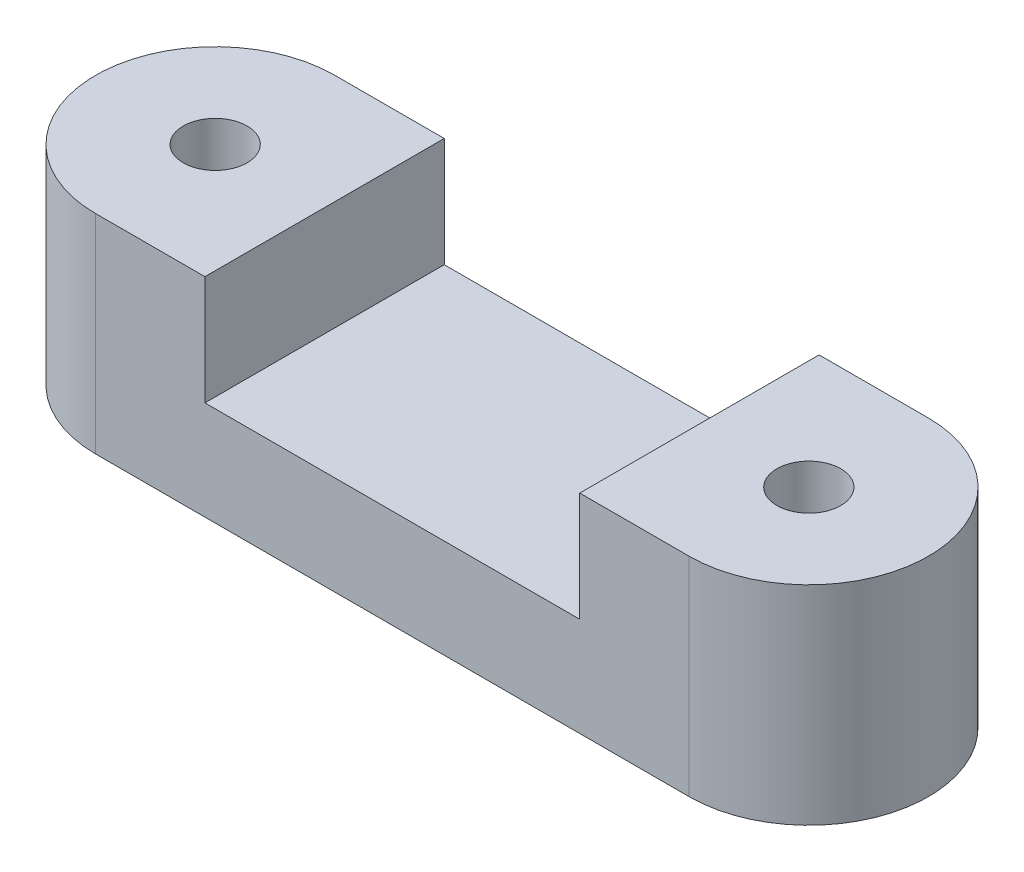
ISO-10303-21;
HEADER;
FILE_DESCRIPTION(('STEP AP214'),'2;1');
FILE_NAME('part.step','',(''),(''),'','','');
FILE_SCHEMA(('AUTOMOTIVE_DESIGN { 1 0 10303 214 1 1 1 1 }'));
ENDSEC;
DATA;
#1=APPLICATION_CONTEXT('core data for automotive mechanical design processes');
#2=APPLICATION_PROTOCOL_DEFINITION('international standard','automotive_design',2000,#1);
#3=PRODUCT_CONTEXT('',#1,'mechanical');
#4=PRODUCT('Part','Part','',(#3));
#5=PRODUCT_RELATED_PRODUCT_CATEGORY('part','',(#4));
#6=PRODUCT_DEFINITION_FORMATION('','',#4);
#7=PRODUCT_DEFINITION_CONTEXT('part definition',#1,'design');
#8=PRODUCT_DEFINITION('design','',#6,#7);
#9=PRODUCT_DEFINITION_SHAPE('','',#8);
#10=(LENGTH_UNIT() NAMED_UNIT(*) SI_UNIT(.MILLI.,.METRE.));
#11=(NAMED_UNIT(*) PLANE_ANGLE_UNIT() SI_UNIT($,.RADIAN.));
#12=(NAMED_UNIT(*) SI_UNIT($,.STERADIAN.) SOLID_ANGLE_UNIT());
#13=UNCERTAINTY_MEASURE_WITH_UNIT(LENGTH_MEASURE(1.E-05),#10,'distance_accuracy_value','');
#14=(GEOMETRIC_REPRESENTATION_CONTEXT(3) GLOBAL_UNCERTAINTY_ASSIGNED_CONTEXT((#13)) GLOBAL_UNIT_ASSIGNED_CONTEXT((#10,
#11,#12)) REPRESENTATION_CONTEXT('',''));
#15=CARTESIAN_POINT('',(0.,0.,0.));
#16=DIRECTION('',(0.,0.,1.));
#17=DIRECTION('',(1.,0.,0.));
#18=AXIS2_PLACEMENT_3D('',#15,#16,#17);
#19=CARTESIAN_POINT('',(0.,9.525,0.));
#20=DIRECTION('',(0.,1.,0.));
#21=DIRECTION('',(0.,0.,1.));
#22=AXIS2_PLACEMENT_3D('',#19,#20,#21);
#23=PLANE('',#22);
#24=DIRECTION('',(0.,0.,-1.));
#25=VECTOR('',#24,1.);
#26=CARTESIAN_POINT('',(22.1488,9.525,5.4737));
#27=LINE('',#26,#25);
#28=CARTESIAN_POINT('',(22.1488,9.525,5.4737));
#29=VERTEX_POINT('',#28);
#30=CARTESIAN_POINT('',(22.1488,9.525,-5.4737));
#31=VERTEX_POINT('',#30);
#32=EDGE_CURVE('E179',#29,#31,#27,.T.);
#33=ORIENTED_EDGE('',*,*,#32,.F.);
#34=DIRECTION('',(1.,0.,0.));
#35=VECTOR('',#34,1.);
#36=CARTESIAN_POINT('',(0.,9.525,5.4737));
#37=LINE('',#36,#35);
#38=CARTESIAN_POINT('',(27.1526,9.525,5.4737));
#39=VERTEX_POINT('',#38);
#40=EDGE_CURVE('E144',#29,#39,#37,.T.);
#41=ORIENTED_EDGE('',*,*,#40,.T.);
#42=CARTESIAN_POINT('',(27.1526,9.525,0.));
#43=DIRECTION('',(0.,1.,0.));
#44=DIRECTION('',(0.,0.,1.));
#45=AXIS2_PLACEMENT_3D('',#42,#43,#44);
#46=CIRCLE('',#45,5.4737);
#47=CARTESIAN_POINT('',(27.1526,9.525,-5.4737));
#48=VERTEX_POINT('',#47);
#49=EDGE_CURVE('E146',#39,#48,#46,.T.);
#50=ORIENTED_EDGE('',*,*,#49,.T.);
#51=DIRECTION('',(-1.,0.,0.));
#52=VECTOR('',#51,1.);
#53=CARTESIAN_POINT('',(0.,9.525,-5.4737));
#54=LINE('',#53,#52);
#55=EDGE_CURVE('E148',#48,#31,#54,.T.);
#56=ORIENTED_EDGE('',*,*,#55,.T.);
#57=EDGE_LOOP('',(#33,#41,#50,#56));
#58=FACE_BOUND('',#57,.T.);
#59=CARTESIAN_POINT('',(27.1526,9.525,0.));
#60=DIRECTION('',(0.,1.,0.));
#61=DIRECTION('',(0.,0.,1.));
#62=AXIS2_PLACEMENT_3D('',#59,#60,#61);
#63=CIRCLE('',#62,1.4605);
#64=CARTESIAN_POINT('',(27.1526,9.525,-1.4605));
#65=VERTEX_POINT('',#64);
#66=EDGE_CURVE('E129',#65,#65,#63,.T.);
#67=ORIENTED_EDGE('',*,*,#66,.F.);
#68=EDGE_LOOP('',(#67));
#69=FACE_BOUND('',#68,.T.);
#70=ADVANCED_FACE('F32',(#58,#69),#23,.T.);
#71=DIRECTION('',(0.,0.,1.));
#72=VECTOR('',#71,1.);
#73=CARTESIAN_POINT('',(5.0038,9.525,5.4737));
#74=LINE('',#73,#72);
#75=CARTESIAN_POINT('',(5.0038,9.525,-5.4737));
#76=VERTEX_POINT('',#75);
#77=CARTESIAN_POINT('',(5.0038,9.525,5.4737));
#78=VERTEX_POINT('',#77);
#79=EDGE_CURVE('E178',#76,#78,#74,.T.);
#80=ORIENTED_EDGE('',*,*,#79,.F.);
#81=CARTESIAN_POINT('',(0.,9.525,-5.4737));
#82=VERTEX_POINT('',#81);
#83=EDGE_CURVE('E56',#76,#82,#54,.T.);
#84=ORIENTED_EDGE('',*,*,#83,.T.);
#85=CARTESIAN_POINT('',(0.,9.525,0.));
#86=DIRECTION('',(0.,1.,0.));
#87=DIRECTION('',(0.,0.,1.));
#88=AXIS2_PLACEMENT_3D('',#85,#86,#87);
#89=CIRCLE('',#88,5.4737);
#90=CARTESIAN_POINT('',(0.,9.525,5.4737));
#91=VERTEX_POINT('',#90);
#92=EDGE_CURVE('E142',#82,#91,#89,.T.);
#93=ORIENTED_EDGE('',*,*,#92,.T.);
#94=EDGE_CURVE('E85',#91,#78,#37,.T.);
#95=ORIENTED_EDGE('',*,*,#94,.T.);
#96=EDGE_LOOP('',(#80,#84,#93,#95));
#97=FACE_BOUND('',#96,.T.);
#98=CARTESIAN_POINT('',(0.,9.525,0.));
#99=DIRECTION('',(0.,1.,0.));
#100=DIRECTION('',(0.,0.,1.));
#101=AXIS2_PLACEMENT_3D('',#98,#99,#100);
#102=CIRCLE('',#101,1.4605);
#103=CARTESIAN_POINT('',(0.,9.525,-1.4605));
#104=VERTEX_POINT('',#103);
#105=EDGE_CURVE('E136',#104,#104,#102,.T.);
#106=ORIENTED_EDGE('',*,*,#105,.F.);
#107=EDGE_LOOP('',(#106));
#108=FACE_BOUND('',#107,.T.);
#109=ADVANCED_FACE('F176',(#97,#108),#23,.T.);
#110=CARTESIAN_POINT('',(0.,0.,0.));
#111=DIRECTION('',(0.,1.,0.));
#112=DIRECTION('',(0.,0.,1.));
#113=AXIS2_PLACEMENT_3D('',#110,#111,#112);
#114=PLANE('',#113);
#115=CARTESIAN_POINT('',(0.,0.,0.));
#116=DIRECTION('',(0.,1.,0.));
#117=DIRECTION('',(0.,0.,1.));
#118=AXIS2_PLACEMENT_3D('',#115,#116,#117);
#119=CIRCLE('',#118,5.4737);
#120=CARTESIAN_POINT('',(0.,0.,-5.4737));
#121=VERTEX_POINT('',#120);
#122=CARTESIAN_POINT('',(0.,0.,5.4737));
#123=VERTEX_POINT('',#122);
#124=EDGE_CURVE('E139',#121,#123,#119,.T.);
#125=ORIENTED_EDGE('',*,*,#124,.F.);
#126=DIRECTION('',(-1.,0.,0.));
#127=VECTOR('',#126,1.);
#128=CARTESIAN_POINT('',(0.,0.,-5.4737));
#129=LINE('',#128,#127);
#130=CARTESIAN_POINT('',(27.1526,0.,-5.4737));
#131=VERTEX_POINT('',#130);
#132=EDGE_CURVE('E78',#131,#121,#129,.T.);
#133=ORIENTED_EDGE('',*,*,#132,.F.);
#134=CARTESIAN_POINT('',(27.1526,0.,0.));
#135=DIRECTION('',(0.,1.,0.));
#136=DIRECTION('',(0.,0.,1.));
#137=AXIS2_PLACEMENT_3D('',#134,#135,#136);
#138=CIRCLE('',#137,5.4737);
#139=CARTESIAN_POINT('',(27.1526,0.,5.4737));
#140=VERTEX_POINT('',#139);
#141=EDGE_CURVE('E156',#140,#131,#138,.T.);
#142=ORIENTED_EDGE('',*,*,#141,.F.);
#143=DIRECTION('',(1.,0.,0.));
#144=VECTOR('',#143,1.);
#145=CARTESIAN_POINT('',(0.,0.,5.4737));
#146=LINE('',#145,#144);
#147=EDGE_CURVE('E154',#123,#140,#146,.T.);
#148=ORIENTED_EDGE('',*,*,#147,.F.);
#149=EDGE_LOOP('',(#125,#133,#142,#148));
#150=FACE_BOUND('',#149,.T.);
#151=CARTESIAN_POINT('',(0.,0.,0.));
#152=DIRECTION('',(0.,1.,0.));
#153=DIRECTION('',(0.,0.,1.));
#154=AXIS2_PLACEMENT_3D('',#151,#152,#153);
#155=CIRCLE('',#154,1.4605);
#156=CARTESIAN_POINT('',(0.,0.,-1.4605));
#157=VERTEX_POINT('',#156);
#158=EDGE_CURVE('E132',#157,#157,#155,.T.);
#159=ORIENTED_EDGE('',*,*,#158,.T.);
#160=EDGE_LOOP('',(#159));
#161=FACE_BOUND('',#160,.T.);
#162=CARTESIAN_POINT('',(27.1526,0.,0.));
#163=DIRECTION('',(0.,1.,0.));
#164=DIRECTION('',(0.,0.,1.));
#165=AXIS2_PLACEMENT_3D('',#162,#163,#164);
#166=CIRCLE('',#165,1.4605);
#167=CARTESIAN_POINT('',(27.1526,0.,-1.4605));
#168=VERTEX_POINT('',#167);
#169=EDGE_CURVE('E133',#168,#168,#166,.T.);
#170=ORIENTED_EDGE('',*,*,#169,.T.);
#171=EDGE_LOOP('',(#170));
#172=FACE_BOUND('',#171,.T.);
#173=ADVANCED_FACE('F171',(#150,#161,#172),#114,.F.);
#174=CARTESIAN_POINT('',(0.,9.525,0.));
#175=DIRECTION('',(0.,-1.,0.));
#176=DIRECTION('',(0.,0.,-1.));
#177=AXIS2_PLACEMENT_3D('',#174,#175,#176);
#178=CYLINDRICAL_SURFACE('',#177,5.4737);
#179=ORIENTED_EDGE('',*,*,#124,.T.);
#180=DIRECTION('',(0.,-1.,0.));
#181=VECTOR('',#180,1.);
#182=CARTESIAN_POINT('',(0.,9.525,5.4737));
#183=LINE('',#182,#181);
#184=EDGE_CURVE('E11',#91,#123,#183,.T.);
#185=ORIENTED_EDGE('',*,*,#184,.F.);
#186=ORIENTED_EDGE('',*,*,#92,.F.);
#187=DIRECTION('',(0.,-1.,0.));
#188=VECTOR('',#187,1.);
#189=CARTESIAN_POINT('',(0.,9.525,-5.4737));
#190=LINE('',#189,#188);
#191=EDGE_CURVE('E151',#82,#121,#190,.T.);
#192=ORIENTED_EDGE('',*,*,#191,.T.);
#193=EDGE_LOOP('',(#179,#185,#186,#192));
#194=FACE_BOUND('',#193,.T.);
#195=ADVANCED_FACE('F34',(#194),#178,.T.);
#196=CARTESIAN_POINT('',(0.,9.525,5.4737));
#197=DIRECTION('',(0.,0.,-1.));
#198=DIRECTION('',(-1.,0.,0.));
#199=AXIS2_PLACEMENT_3D('',#196,#197,#198);
#200=PLANE('',#199);
#201=ORIENTED_EDGE('',*,*,#40,.F.);
#202=DIRECTION('',(0.,1.,0.));
#203=VECTOR('',#202,1.);
#204=CARTESIAN_POINT('',(22.1488,4.525,5.4737));
#205=LINE('',#204,#203);
#206=CARTESIAN_POINT('',(22.1488,4.525,5.4737));
#207=VERTEX_POINT('',#206);
#208=EDGE_CURVE('E124',#207,#29,#205,.T.);
#209=ORIENTED_EDGE('',*,*,#208,.F.);
#210=DIRECTION('',(1.,0.,0.));
#211=VECTOR('',#210,1.);
#212=CARTESIAN_POINT('',(5.0038,4.525,5.4737));
#213=LINE('',#212,#211);
#214=CARTESIAN_POINT('',(5.0038,4.525,5.4737));
#215=VERTEX_POINT('',#214);
#216=EDGE_CURVE('E114',#215,#207,#213,.T.);
#217=ORIENTED_EDGE('',*,*,#216,.F.);
#218=DIRECTION('',(0.,1.,0.));
#219=VECTOR('',#218,1.);
#220=CARTESIAN_POINT('',(5.0038,4.525,5.4737));
#221=LINE('',#220,#219);
#222=EDGE_CURVE('E112',#215,#78,#221,.T.);
#223=ORIENTED_EDGE('',*,*,#222,.T.);
#224=ORIENTED_EDGE('',*,*,#94,.F.);
#225=ORIENTED_EDGE('',*,*,#184,.T.);
#226=ORIENTED_EDGE('',*,*,#147,.T.);
#227=DIRECTION('',(0.,-1.,0.));
#228=VECTOR('',#227,1.);
#229=CARTESIAN_POINT('',(27.1526,9.525,5.4737));
#230=LINE('',#229,#228);
#231=EDGE_CURVE('E40',#39,#140,#230,.T.);
#232=ORIENTED_EDGE('',*,*,#231,.F.);
#233=EDGE_LOOP('',(#201,#209,#217,#223,#224,#225,#226,#232));
#234=FACE_BOUND('',#233,.T.);
#235=ADVANCED_FACE('F191',(#234),#200,.F.);
#236=CARTESIAN_POINT('',(27.1526,9.525,0.));
#237=DIRECTION('',(0.,-1.,0.));
#238=DIRECTION('',(0.,0.,-1.));
#239=AXIS2_PLACEMENT_3D('',#236,#237,#238);
#240=CYLINDRICAL_SURFACE('',#239,5.4737);
#241=ORIENTED_EDGE('',*,*,#141,.T.);
#242=DIRECTION('',(0.,-1.,0.));
#243=VECTOR('',#242,1.);
#244=CARTESIAN_POINT('',(27.1526,9.525,-5.4737));
#245=LINE('',#244,#243);
#246=EDGE_CURVE('E160',#48,#131,#245,.T.);
#247=ORIENTED_EDGE('',*,*,#246,.F.);
#248=ORIENTED_EDGE('',*,*,#49,.F.);
#249=ORIENTED_EDGE('',*,*,#231,.T.);
#250=EDGE_LOOP('',(#241,#247,#248,#249));
#251=FACE_BOUND('',#250,.T.);
#252=ADVANCED_FACE('F166',(#251),#240,.T.);
#253=CARTESIAN_POINT('',(0.,9.525,-5.4737));
#254=DIRECTION('',(0.,0.,1.));
#255=DIRECTION('',(1.,0.,0.));
#256=AXIS2_PLACEMENT_3D('',#253,#254,#255);
#257=PLANE('',#256);
#258=DIRECTION('',(-1.,0.,0.));
#259=VECTOR('',#258,1.);
#260=CARTESIAN_POINT('',(5.0038,4.525,-5.4737));
#261=LINE('',#260,#259);
#262=CARTESIAN_POINT('',(22.1488,4.525,-5.4737));
#263=VERTEX_POINT('',#262);
#264=CARTESIAN_POINT('',(5.0038,4.525,-5.4737));
#265=VERTEX_POINT('',#264);
#266=EDGE_CURVE('E115',#263,#265,#261,.T.);
#267=ORIENTED_EDGE('',*,*,#266,.F.);
#268=DIRECTION('',(0.,1.,0.));
#269=VECTOR('',#268,1.);
#270=CARTESIAN_POINT('',(22.1488,4.525,-5.4737));
#271=LINE('',#270,#269);
#272=EDGE_CURVE('E122',#263,#31,#271,.T.);
#273=ORIENTED_EDGE('',*,*,#272,.T.);
#274=ORIENTED_EDGE('',*,*,#55,.F.);
#275=ORIENTED_EDGE('',*,*,#246,.T.);
#276=ORIENTED_EDGE('',*,*,#132,.T.);
#277=ORIENTED_EDGE('',*,*,#191,.F.);
#278=ORIENTED_EDGE('',*,*,#83,.F.);
#279=DIRECTION('',(0.,1.,0.));
#280=VECTOR('',#279,1.);
#281=CARTESIAN_POINT('',(5.0038,4.525,-5.4737));
#282=LINE('',#281,#280);
#283=EDGE_CURVE('E111',#265,#76,#282,.T.);
#284=ORIENTED_EDGE('',*,*,#283,.F.);
#285=EDGE_LOOP('',(#267,#273,#274,#275,#276,#277,#278,#284));
#286=FACE_BOUND('',#285,.T.);
#287=ADVANCED_FACE('F121',(#286),#257,.F.);
#288=CARTESIAN_POINT('',(0.,9.525,0.));
#289=DIRECTION('',(0.,-1.,0.));
#290=DIRECTION('',(0.,0.,-1.));
#291=AXIS2_PLACEMENT_3D('',#288,#289,#290);
#292=CYLINDRICAL_SURFACE('',#291,1.4605);
#293=CARTESIAN_POINT('',(0.,9.525,-1.4605));
#294=CARTESIAN_POINT('',(0.,9.42578125,-1.4605));
#295=CARTESIAN_POINT('',(0.,9.3265625,-1.4605));
#296=CARTESIAN_POINT('',(0.,9.128125,-1.4605));
#297=CARTESIAN_POINT('',(0.,9.02890625,-1.4605));
#298=CARTESIAN_POINT('',(0.,8.83046875,-1.4605));
#299=CARTESIAN_POINT('',(0.,8.73125,-1.4605));
#300=CARTESIAN_POINT('',(0.,8.5328125,-1.4605));
#301=CARTESIAN_POINT('',(0.,8.43359375,-1.4605));
#302=CARTESIAN_POINT('',(0.,8.23515625,-1.4605));
#303=CARTESIAN_POINT('',(0.,8.1359375,-1.4605));
#304=CARTESIAN_POINT('',(0.,7.9375,-1.4605));
#305=CARTESIAN_POINT('',(0.,7.83828125,-1.4605));
#306=CARTESIAN_POINT('',(0.,7.63984375,-1.4605));
#307=CARTESIAN_POINT('',(0.,7.540625,-1.4605));
#308=CARTESIAN_POINT('',(0.,7.3421875,-1.4605));
#309=CARTESIAN_POINT('',(0.,7.24296875,-1.4605));
#310=CARTESIAN_POINT('',(0.,7.04453125,-1.4605));
#311=CARTESIAN_POINT('',(0.,6.9453125,-1.4605));
#312=CARTESIAN_POINT('',(0.,6.746875,-1.4605));
#313=CARTESIAN_POINT('',(0.,6.64765625,-1.4605));
#314=CARTESIAN_POINT('',(0.,6.44921875,-1.4605));
#315=CARTESIAN_POINT('',(0.,6.35,-1.4605));
#316=CARTESIAN_POINT('',(0.,6.1515625,-1.4605));
#317=CARTESIAN_POINT('',(0.,6.05234375,-1.4605));
#318=CARTESIAN_POINT('',(0.,5.85390625,-1.4605));
#319=CARTESIAN_POINT('',(0.,5.7546875,-1.4605));
#320=CARTESIAN_POINT('',(0.,5.55625,-1.4605));
#321=CARTESIAN_POINT('',(0.,5.45703125,-1.4605));
#322=CARTESIAN_POINT('',(0.,5.25859375,-1.4605));
#323=CARTESIAN_POINT('',(0.,5.159375,-1.4605));
#324=CARTESIAN_POINT('',(0.,4.9609375,-1.4605));
#325=CARTESIAN_POINT('',(0.,4.86171875,-1.4605));
#326=CARTESIAN_POINT('',(0.,4.66328125,-1.4605));
#327=CARTESIAN_POINT('',(0.,4.5640625,-1.4605));
#328=CARTESIAN_POINT('',(0.,4.365625,-1.4605));
#329=CARTESIAN_POINT('',(0.,4.26640625,-1.4605));
#330=CARTESIAN_POINT('',(0.,4.06796875,-1.4605));
#331=CARTESIAN_POINT('',(0.,3.96875,-1.4605));
#332=CARTESIAN_POINT('',(0.,3.7703125,-1.4605));
#333=CARTESIAN_POINT('',(0.,3.67109375,-1.4605));
#334=CARTESIAN_POINT('',(0.,3.47265625,-1.4605));
#335=CARTESIAN_POINT('',(0.,3.3734375,-1.4605));
#336=CARTESIAN_POINT('',(0.,3.175,-1.4605));
#337=CARTESIAN_POINT('',(0.,3.07578125,-1.4605));
#338=CARTESIAN_POINT('',(0.,2.87734375,-1.4605));
#339=CARTESIAN_POINT('',(0.,2.778125,-1.4605));
#340=CARTESIAN_POINT('',(0.,2.5796875,-1.4605));
#341=CARTESIAN_POINT('',(0.,2.48046875,-1.4605));
#342=CARTESIAN_POINT('',(0.,2.28203125,-1.4605));
#343=CARTESIAN_POINT('',(0.,2.1828125,-1.4605));
#344=CARTESIAN_POINT('',(0.,1.984375,-1.4605));
#345=CARTESIAN_POINT('',(0.,1.88515625,-1.4605));
#346=CARTESIAN_POINT('',(0.,1.68671875,-1.4605));
#347=CARTESIAN_POINT('',(0.,1.5875,-1.4605));
#348=CARTESIAN_POINT('',(0.,1.3890625,-1.4605));
#349=CARTESIAN_POINT('',(0.,1.28984375,-1.4605));
#350=CARTESIAN_POINT('',(0.,1.09140625,-1.4605));
#351=CARTESIAN_POINT('',(0.,0.992187500000001,-1.4605));
#352=CARTESIAN_POINT('',(0.,0.793750000000001,-1.4605));
#353=CARTESIAN_POINT('',(0.,0.69453125,-1.4605));
#354=CARTESIAN_POINT('',(0.,0.49609375,-1.4605));
#355=CARTESIAN_POINT('',(0.,0.396875,-1.4605));
#356=CARTESIAN_POINT('',(0.,0.1984375,-1.4605));
#357=CARTESIAN_POINT('',(0.,0.0992187500000001,-1.4605));
#358=CARTESIAN_POINT('',(0.,0.,-1.4605));
#359=B_SPLINE_CURVE_WITH_KNOTS('',3,(#293,#294,#295,#296,#297,#298,#299,#300,#301,#302,#303,
#304,#305,#306,#307,#308,#309,#310,#311,#312,#313,#314,#315,#316,#317,#318,#319,#320,#321,#322,
#323,#324,#325,#326,#327,#328,#329,#330,#331,#332,#333,#334,#335,#336,#337,#338,#339,#340,#341,
#342,#343,#344,#345,#346,#347,#348,#349,#350,#351,#352,#353,#354,#355,#356,#357,#358),
.UNSPECIFIED.,.F.,.F.,(4,2,2,2,2,2,2,2,2,2,2,2,2,2,2,2,2,2,2,2,2,2,2,2,2,2,2,2,2,2,2,2,4),(0.,
0.29765625,0.5953125,0.892968750000001,1.190625,1.48828125,1.7859375,2.08359375,2.38125,
2.67890625,2.9765625,3.27421875,3.571875,3.86953125,4.1671875,4.46484375,4.7625,5.06015625,
5.3578125,5.65546875,5.953125,6.25078125,6.5484375,6.84609375,7.14375,7.44140625,7.7390625,
8.03671875,8.334375,8.63203125,8.9296875,9.22734375,9.525),.UNSPECIFIED.);
#360=EDGE_CURVE('BSEAM205',#104,#157,#359,.T.);
#361=ORIENTED_EDGE('',*,*,#105,.T.);
#362=ORIENTED_EDGE('',*,*,#158,.F.);
#363=ORIENTED_EDGE('',*,*,#360,.T.);
#364=ORIENTED_EDGE('',*,*,#360,.F.);
#365=EDGE_LOOP('',(#361,#363,#362,#364));
#366=FACE_BOUND('',#365,.T.);
#367=ADVANCED_FACE('F205',(#366),#292,.F.);
#368=CARTESIAN_POINT('',(27.1526,9.525,0.));
#369=DIRECTION('',(0.,-1.,0.));
#370=DIRECTION('',(0.,0.,-1.));
#371=AXIS2_PLACEMENT_3D('',#368,#369,#370);
#372=CYLINDRICAL_SURFACE('',#371,1.4605);
#373=CARTESIAN_POINT('',(27.1526,9.525,-1.4605));
#374=CARTESIAN_POINT('',(27.1526,9.42578125,-1.4605));
#375=CARTESIAN_POINT('',(27.1526,9.3265625,-1.4605));
#376=CARTESIAN_POINT('',(27.1526,9.128125,-1.4605));
#377=CARTESIAN_POINT('',(27.1526,9.02890625,-1.4605));
#378=CARTESIAN_POINT('',(27.1526,8.83046875,-1.4605));
#379=CARTESIAN_POINT('',(27.1526,8.73125,-1.4605));
#380=CARTESIAN_POINT('',(27.1526,8.5328125,-1.4605));
#381=CARTESIAN_POINT('',(27.1526,8.43359375,-1.4605));
#382=CARTESIAN_POINT('',(27.1526,8.23515625,-1.4605));
#383=CARTESIAN_POINT('',(27.1526,8.1359375,-1.4605));
#384=CARTESIAN_POINT('',(27.1526,7.9375,-1.4605));
#385=CARTESIAN_POINT('',(27.1526,7.83828125,-1.4605));
#386=CARTESIAN_POINT('',(27.1526,7.63984375,-1.4605));
#387=CARTESIAN_POINT('',(27.1526,7.540625,-1.4605));
#388=CARTESIAN_POINT('',(27.1526,7.3421875,-1.4605));
#389=CARTESIAN_POINT('',(27.1526,7.24296875,-1.4605));
#390=CARTESIAN_POINT('',(27.1526,7.04453125,-1.4605));
#391=CARTESIAN_POINT('',(27.1526,6.9453125,-1.4605));
#392=CARTESIAN_POINT('',(27.1526,6.746875,-1.4605));
#393=CARTESIAN_POINT('',(27.1526,6.64765625,-1.4605));
#394=CARTESIAN_POINT('',(27.1526,6.44921875,-1.4605));
#395=CARTESIAN_POINT('',(27.1526,6.35,-1.4605));
#396=CARTESIAN_POINT('',(27.1526,6.1515625,-1.4605));
#397=CARTESIAN_POINT('',(27.1526,6.05234375,-1.4605));
#398=CARTESIAN_POINT('',(27.1526,5.85390625,-1.4605));
#399=CARTESIAN_POINT('',(27.1526,5.7546875,-1.4605));
#400=CARTESIAN_POINT('',(27.1526,5.55625,-1.4605));
#401=CARTESIAN_POINT('',(27.1526,5.45703125,-1.4605));
#402=CARTESIAN_POINT('',(27.1526,5.25859375,-1.4605));
#403=CARTESIAN_POINT('',(27.1526,5.159375,-1.4605));
#404=CARTESIAN_POINT('',(27.1526,4.9609375,-1.4605));
#405=CARTESIAN_POINT('',(27.1526,4.86171875,-1.4605));
#406=CARTESIAN_POINT('',(27.1526,4.66328125,-1.4605));
#407=CARTESIAN_POINT('',(27.1526,4.5640625,-1.4605));
#408=CARTESIAN_POINT('',(27.1526,4.365625,-1.4605));
#409=CARTESIAN_POINT('',(27.1526,4.26640625,-1.4605));
#410=CARTESIAN_POINT('',(27.1526,4.06796875,-1.4605));
#411=CARTESIAN_POINT('',(27.1526,3.96875,-1.4605));
#412=CARTESIAN_POINT('',(27.1526,3.7703125,-1.4605));
#413=CARTESIAN_POINT('',(27.1526,3.67109375,-1.4605));
#414=CARTESIAN_POINT('',(27.1526,3.47265625,-1.4605));
#415=CARTESIAN_POINT('',(27.1526,3.3734375,-1.4605));
#416=CARTESIAN_POINT('',(27.1526,3.175,-1.4605));
#417=CARTESIAN_POINT('',(27.1526,3.07578125,-1.4605));
#418=CARTESIAN_POINT('',(27.1526,2.87734375,-1.4605));
#419=CARTESIAN_POINT('',(27.1526,2.778125,-1.4605));
#420=CARTESIAN_POINT('',(27.1526,2.5796875,-1.4605));
#421=CARTESIAN_POINT('',(27.1526,2.48046875,-1.4605));
#422=CARTESIAN_POINT('',(27.1526,2.28203125,-1.4605));
#423=CARTESIAN_POINT('',(27.1526,2.1828125,-1.4605));
#424=CARTESIAN_POINT('',(27.1526,1.984375,-1.4605));
#425=CARTESIAN_POINT('',(27.1526,1.88515625,-1.4605));
#426=CARTESIAN_POINT('',(27.1526,1.68671875,-1.4605));
#427=CARTESIAN_POINT('',(27.1526,1.5875,-1.4605));
#428=CARTESIAN_POINT('',(27.1526,1.3890625,-1.4605));
#429=CARTESIAN_POINT('',(27.1526,1.28984375,-1.4605));
#430=CARTESIAN_POINT('',(27.1526,1.09140625,-1.4605));
#431=CARTESIAN_POINT('',(27.1526,0.992187500000001,-1.4605));
#432=CARTESIAN_POINT('',(27.1526,0.793750000000001,-1.4605));
#433=CARTESIAN_POINT('',(27.1526,0.69453125,-1.4605));
#434=CARTESIAN_POINT('',(27.1526,0.49609375,-1.4605));
#435=CARTESIAN_POINT('',(27.1526,0.396875,-1.4605));
#436=CARTESIAN_POINT('',(27.1526,0.1984375,-1.4605));
#437=CARTESIAN_POINT('',(27.1526,0.0992187500000001,-1.4605));
#438=CARTESIAN_POINT('',(27.1526,0.,-1.4605));
#439=B_SPLINE_CURVE_WITH_KNOTS('',3,(#373,#374,#375,#376,#377,#378,#379,#380,#381,#382,#383,
#384,#385,#386,#387,#388,#389,#390,#391,#392,#393,#394,#395,#396,#397,#398,#399,#400,#401,#402,
#403,#404,#405,#406,#407,#408,#409,#410,#411,#412,#413,#414,#415,#416,#417,#418,#419,#420,#421,
#422,#423,#424,#425,#426,#427,#428,#429,#430,#431,#432,#433,#434,#435,#436,#437,#438),
.UNSPECIFIED.,.F.,.F.,(4,2,2,2,2,2,2,2,2,2,2,2,2,2,2,2,2,2,2,2,2,2,2,2,2,2,2,2,2,2,2,2,4),(0.,
0.29765625,0.5953125,0.892968750000001,1.190625,1.48828125,1.7859375,2.08359375,2.38125,
2.67890625,2.9765625,3.27421875,3.571875,3.86953125,4.1671875,4.46484375,4.7625,5.06015625,
5.3578125,5.65546875,5.953125,6.25078125,6.5484375,6.84609375,7.14375,7.44140625,7.7390625,
8.03671875,8.334375,8.63203125,8.9296875,9.22734375,9.525),.UNSPECIFIED.);
#440=EDGE_CURVE('BSEAM213',#65,#168,#439,.T.);
#441=ORIENTED_EDGE('',*,*,#66,.T.);
#442=ORIENTED_EDGE('',*,*,#169,.F.);
#443=ORIENTED_EDGE('',*,*,#440,.T.);
#444=ORIENTED_EDGE('',*,*,#440,.F.);
#445=EDGE_LOOP('',(#441,#443,#442,#444));
#446=FACE_BOUND('',#445,.T.);
#447=ADVANCED_FACE('F213',(#446),#372,.F.);
#448=CARTESIAN_POINT('',(22.1488,4.525,5.4737));
#449=DIRECTION('',(1.,0.,0.));
#450=DIRECTION('',(0.,0.,-1.));
#451=AXIS2_PLACEMENT_3D('',#448,#449,#450);
#452=PLANE('',#451);
#453=ORIENTED_EDGE('',*,*,#32,.T.);
#454=ORIENTED_EDGE('',*,*,#272,.F.);
#455=DIRECTION('',(0.,0.,-1.));
#456=VECTOR('',#455,1.);
#457=CARTESIAN_POINT('',(22.1488,4.525,5.4737));
#458=LINE('',#457,#456);
#459=EDGE_CURVE('E47',#207,#263,#458,.T.);
#460=ORIENTED_EDGE('',*,*,#459,.F.);
#461=ORIENTED_EDGE('',*,*,#208,.T.);
#462=EDGE_LOOP('',(#453,#454,#460,#461));
#463=FACE_BOUND('',#462,.T.);
#464=ADVANCED_FACE('F187',(#463),#452,.F.);
#465=CARTESIAN_POINT('',(5.0038,4.525,5.4737));
#466=DIRECTION('',(-1.,0.,0.));
#467=DIRECTION('',(0.,0.,1.));
#468=AXIS2_PLACEMENT_3D('',#465,#466,#467);
#469=PLANE('',#468);
#470=ORIENTED_EDGE('',*,*,#79,.T.);
#471=ORIENTED_EDGE('',*,*,#222,.F.);
#472=DIRECTION('',(0.,0.,1.));
#473=VECTOR('',#472,1.);
#474=CARTESIAN_POINT('',(5.0038,4.525,5.4737));
#475=LINE('',#474,#473);
#476=EDGE_CURVE('E108',#265,#215,#475,.T.);
#477=ORIENTED_EDGE('',*,*,#476,.F.);
#478=ORIENTED_EDGE('',*,*,#283,.T.);
#479=EDGE_LOOP('',(#470,#471,#477,#478));
#480=FACE_BOUND('',#479,.T.);
#481=ADVANCED_FACE('F109',(#480),#469,.F.);
#482=CARTESIAN_POINT('',(0.,4.525,0.));
#483=DIRECTION('',(0.,-1.,0.));
#484=DIRECTION('',(0.,0.,-1.));
#485=AXIS2_PLACEMENT_3D('',#482,#483,#484);
#486=PLANE('',#485);
#487=ORIENTED_EDGE('',*,*,#459,.T.);
#488=ORIENTED_EDGE('',*,*,#266,.T.);
#489=ORIENTED_EDGE('',*,*,#476,.T.);
#490=ORIENTED_EDGE('',*,*,#216,.T.);
#491=EDGE_LOOP('',(#487,#488,#489,#490));
#492=FACE_BOUND('',#491,.T.);
#493=ADVANCED_FACE('F118',(#492),#486,.F.);
#494=CLOSED_SHELL('',(#70,#109,#173,#195,#235,#252,#287,#367,#447,#464,#481,#493));
#495=MANIFOLD_SOLID_BREP('B2',#494);
#496=ADVANCED_BREP_SHAPE_REPRESENTATION('',(#18,#495),#14);
#497=SHAPE_DEFINITION_REPRESENTATION(#9,#496);
ENDSEC;
END-ISO-10303-21;
